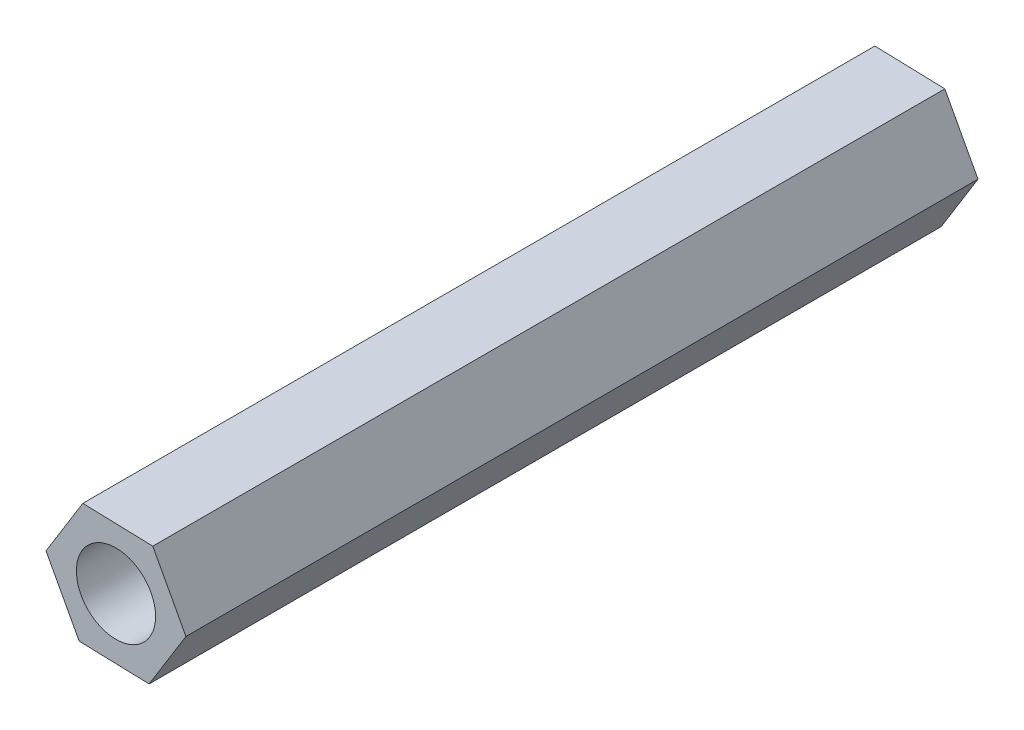
ISO-10303-21;
HEADER;
FILE_DESCRIPTION(('STEP AP214'),'2;1');
FILE_NAME('part.step','',(''),(''),'','','');
FILE_SCHEMA(('AUTOMOTIVE_DESIGN { 1 0 10303 214 1 1 1 1 }'));
ENDSEC;
DATA;
#1=APPLICATION_CONTEXT('core data for automotive mechanical design processes');
#2=APPLICATION_PROTOCOL_DEFINITION('international standard','automotive_design',2000,#1);
#3=PRODUCT_CONTEXT('',#1,'mechanical');
#4=PRODUCT('Part','Part','',(#3));
#5=PRODUCT_RELATED_PRODUCT_CATEGORY('part','',(#4));
#6=PRODUCT_DEFINITION_FORMATION('','',#4);
#7=PRODUCT_DEFINITION_CONTEXT('part definition',#1,'design');
#8=PRODUCT_DEFINITION('design','',#6,#7);
#9=PRODUCT_DEFINITION_SHAPE('','',#8);
#10=(LENGTH_UNIT() NAMED_UNIT(*) SI_UNIT(.MILLI.,.METRE.));
#11=(NAMED_UNIT(*) PLANE_ANGLE_UNIT() SI_UNIT($,.RADIAN.));
#12=(NAMED_UNIT(*) SI_UNIT($,.STERADIAN.) SOLID_ANGLE_UNIT());
#13=UNCERTAINTY_MEASURE_WITH_UNIT(LENGTH_MEASURE(1.E-05),#10,'distance_accuracy_value','');
#14=(GEOMETRIC_REPRESENTATION_CONTEXT(3) GLOBAL_UNCERTAINTY_ASSIGNED_CONTEXT((#13)) GLOBAL_UNIT_ASSIGNED_CONTEXT((#10,
#11,#12)) REPRESENTATION_CONTEXT('',''));
#15=CARTESIAN_POINT('',(0.,0.,0.));
#16=DIRECTION('',(0.,0.,1.));
#17=DIRECTION('',(1.,0.,0.));
#18=AXIS2_PLACEMENT_3D('',#15,#16,#17);
#19=CARTESIAN_POINT('',(0.,0.,30.));
#20=DIRECTION('',(0.,0.,1.));
#21=DIRECTION('',(1.,0.,0.));
#22=AXIS2_PLACEMENT_3D('',#19,#20,#21);
#23=PLANE('',#22);
#24=DIRECTION('',(0.999547968895249,-0.0300642291998806,0.));
#25=VECTOR('',#24,1.);
#26=CARTESIAN_POINT('',(-1.39402762614969,-2.25511420148972,30.));
#27=LINE('',#26,#25);
#28=CARTESIAN_POINT('',(-1.39402762614969,-2.25511420148972,30.));
#29=VERTEX_POINT('',#28);
#30=CARTESIAN_POINT('',(1.25597237385031,-2.33482043856781,30.));
#31=VERTEX_POINT('',#30);
#32=EDGE_CURVE('E131',#29,#31,#27,.T.);
#33=ORIENTED_EDGE('',*,*,#32,.T.);
#34=DIRECTION('',(0.525810370679919,0.850601818764483,0.));
#35=VECTOR('',#34,1.);
#36=CARTESIAN_POINT('',(1.25597237385031,-2.33482043856781,30.));
#37=LINE('',#36,#35);
#38=CARTESIAN_POINT('',(2.65,-0.0797062370780844,30.));
#39=VERTEX_POINT('',#38);
#40=EDGE_CURVE('E89',#31,#39,#37,.T.);
#41=ORIENTED_EDGE('',*,*,#40,.T.);
#42=DIRECTION('',(-0.47373759821533,0.880666047964363,0.));
#43=VECTOR('',#42,1.);
#44=CARTESIAN_POINT('',(2.65,-0.0797062370780844,30.));
#45=LINE('',#44,#43);
#46=CARTESIAN_POINT('',(1.39402762614969,2.25511420148972,30.));
#47=VERTEX_POINT('',#46);
#48=EDGE_CURVE('E102',#39,#47,#45,.T.);
#49=ORIENTED_EDGE('',*,*,#48,.T.);
#50=DIRECTION('',(-0.999547968895249,0.0300642291998806,0.));
#51=VECTOR('',#50,1.);
#52=CARTESIAN_POINT('',(1.39402762614969,2.25511420148972,30.));
#53=LINE('',#52,#51);
#54=CARTESIAN_POINT('',(-1.25597237385031,2.33482043856781,30.));
#55=VERTEX_POINT('',#54);
#56=EDGE_CURVE('E96',#47,#55,#53,.T.);
#57=ORIENTED_EDGE('',*,*,#56,.T.);
#58=DIRECTION('',(-0.525810370679919,-0.850601818764483,0.));
#59=VECTOR('',#58,1.);
#60=CARTESIAN_POINT('',(-1.25597237385031,2.33482043856781,30.));
#61=LINE('',#60,#59);
#62=CARTESIAN_POINT('',(-2.65,0.0797062370780848,30.));
#63=VERTEX_POINT('',#62);
#64=EDGE_CURVE('E100',#55,#63,#61,.T.);
#65=ORIENTED_EDGE('',*,*,#64,.T.);
#66=DIRECTION('',(0.47373759821533,-0.880666047964363,0.));
#67=VECTOR('',#66,1.);
#68=CARTESIAN_POINT('',(-2.65,0.0797062370780848,30.));
#69=LINE('',#68,#67);
#70=EDGE_CURVE('E52',#63,#29,#69,.T.);
#71=ORIENTED_EDGE('',*,*,#70,.T.);
#72=EDGE_LOOP('',(#33,#41,#49,#57,#65,#71));
#73=FACE_BOUND('',#72,.T.);
#74=CARTESIAN_POINT('',(0.,0.,30.));
#75=DIRECTION('',(0.,0.,1.));
#76=DIRECTION('',(1.,0.,0.));
#77=AXIS2_PLACEMENT_3D('',#74,#75,#76);
#78=CIRCLE('',#77,1.5);
#79=CARTESIAN_POINT('',(1.5,0.,30.));
#80=VERTEX_POINT('',#79);
#81=EDGE_CURVE('E124',#80,#80,#78,.T.);
#82=ORIENTED_EDGE('',*,*,#81,.F.);
#83=EDGE_LOOP('',(#82));
#84=FACE_BOUND('',#83,.T.);
#85=ADVANCED_FACE('F35',(#73,#84),#23,.T.);
#86=CARTESIAN_POINT('',(0.,0.,0.));
#87=DIRECTION('',(0.,0.,1.));
#88=DIRECTION('',(1.,0.,0.));
#89=AXIS2_PLACEMENT_3D('',#86,#87,#88);
#90=PLANE('',#89);
#91=DIRECTION('',(0.999547968895249,-0.0300642291998806,0.));
#92=VECTOR('',#91,1.);
#93=CARTESIAN_POINT('',(-1.39402762614969,-2.25511420148972,0.));
#94=LINE('',#93,#92);
#95=CARTESIAN_POINT('',(-1.39402762614969,-2.25511420148972,0.));
#96=VERTEX_POINT('',#95);
#97=CARTESIAN_POINT('',(1.25597237385031,-2.33482043856781,0.));
#98=VERTEX_POINT('',#97);
#99=EDGE_CURVE('E120',#96,#98,#94,.T.);
#100=ORIENTED_EDGE('',*,*,#99,.F.);
#101=DIRECTION('',(0.47373759821533,-0.880666047964363,0.));
#102=VECTOR('',#101,1.);
#103=CARTESIAN_POINT('',(-2.65,0.0797062370780848,0.));
#104=LINE('',#103,#102);
#105=CARTESIAN_POINT('',(-2.65,0.0797062370780848,0.));
#106=VERTEX_POINT('',#105);
#107=EDGE_CURVE('E81',#106,#96,#104,.T.);
#108=ORIENTED_EDGE('',*,*,#107,.F.);
#109=DIRECTION('',(-0.525810370679919,-0.850601818764483,0.));
#110=VECTOR('',#109,1.);
#111=CARTESIAN_POINT('',(-1.25597237385031,2.33482043856781,0.));
#112=LINE('',#111,#110);
#113=CARTESIAN_POINT('',(-1.25597237385031,2.33482043856781,0.));
#114=VERTEX_POINT('',#113);
#115=EDGE_CURVE('E75',#114,#106,#112,.T.);
#116=ORIENTED_EDGE('',*,*,#115,.F.);
#117=DIRECTION('',(-0.999547968895249,0.0300642291998806,0.));
#118=VECTOR('',#117,1.);
#119=CARTESIAN_POINT('',(1.39402762614969,2.25511420148972,0.));
#120=LINE('',#119,#118);
#121=CARTESIAN_POINT('',(1.39402762614969,2.25511420148972,0.));
#122=VERTEX_POINT('',#121);
#123=EDGE_CURVE('E110',#122,#114,#120,.T.);
#124=ORIENTED_EDGE('',*,*,#123,.F.);
#125=DIRECTION('',(-0.47373759821533,0.880666047964363,0.));
#126=VECTOR('',#125,1.);
#127=CARTESIAN_POINT('',(2.65,-0.0797062370780844,0.));
#128=LINE('',#127,#126);
#129=CARTESIAN_POINT('',(2.65,-0.0797062370780844,0.));
#130=VERTEX_POINT('',#129);
#131=EDGE_CURVE('E126',#130,#122,#128,.T.);
#132=ORIENTED_EDGE('',*,*,#131,.F.);
#133=DIRECTION('',(0.525810370679919,0.850601818764483,0.));
#134=VECTOR('',#133,1.);
#135=CARTESIAN_POINT('',(1.25597237385031,-2.33482043856781,0.));
#136=LINE('',#135,#134);
#137=EDGE_CURVE('E123',#98,#130,#136,.T.);
#138=ORIENTED_EDGE('',*,*,#137,.F.);
#139=EDGE_LOOP('',(#100,#108,#116,#124,#132,#138));
#140=FACE_BOUND('',#139,.T.);
#141=CARTESIAN_POINT('',(0.,0.,0.));
#142=DIRECTION('',(0.,0.,1.));
#143=DIRECTION('',(1.,0.,0.));
#144=AXIS2_PLACEMENT_3D('',#141,#142,#143);
#145=CIRCLE('',#144,1.5);
#146=CARTESIAN_POINT('',(1.5,0.,0.));
#147=VERTEX_POINT('',#146);
#148=EDGE_CURVE('E224',#147,#147,#145,.T.);
#149=ORIENTED_EDGE('',*,*,#148,.T.);
#150=EDGE_LOOP('',(#149));
#151=FACE_BOUND('',#150,.T.);
#152=ADVANCED_FACE('F140',(#140,#151),#90,.F.);
#153=CARTESIAN_POINT('',(-1.39402762614969,-2.25511420148972,30.));
#154=DIRECTION('',(0.0300642291998806,0.999547968895249,0.));
#155=DIRECTION('',(-0.999547968895249,0.0300642291998806,0.));
#156=AXIS2_PLACEMENT_3D('',#153,#154,#155);
#157=PLANE('',#156);
#158=ORIENTED_EDGE('',*,*,#99,.T.);
#159=DIRECTION('',(0.,0.,-1.));
#160=VECTOR('',#159,1.);
#161=CARTESIAN_POINT('',(1.25597237385031,-2.33482043856781,30.));
#162=LINE('',#161,#160);
#163=EDGE_CURVE('E11',#31,#98,#162,.T.);
#164=ORIENTED_EDGE('',*,*,#163,.F.);
#165=ORIENTED_EDGE('',*,*,#32,.F.);
#166=DIRECTION('',(0.,0.,-1.));
#167=VECTOR('',#166,1.);
#168=CARTESIAN_POINT('',(-1.39402762614969,-2.25511420148972,30.));
#169=LINE('',#168,#167);
#170=EDGE_CURVE('E116',#29,#96,#169,.T.);
#171=ORIENTED_EDGE('',*,*,#170,.T.);
#172=EDGE_LOOP('',(#158,#164,#165,#171));
#173=FACE_BOUND('',#172,.T.);
#174=ADVANCED_FACE('F37',(#173),#157,.F.);
#175=CARTESIAN_POINT('',(1.25597237385031,-2.33482043856781,30.));
#176=DIRECTION('',(-0.850601818764483,0.525810370679919,0.));
#177=DIRECTION('',(-0.525810370679919,-0.850601818764483,0.));
#178=AXIS2_PLACEMENT_3D('',#175,#176,#177);
#179=PLANE('',#178);
#180=ORIENTED_EDGE('',*,*,#137,.T.);
#181=DIRECTION('',(0.,0.,-1.));
#182=VECTOR('',#181,1.);
#183=CARTESIAN_POINT('',(2.65,-0.0797062370780844,30.));
#184=LINE('',#183,#182);
#185=EDGE_CURVE('E44',#39,#130,#184,.T.);
#186=ORIENTED_EDGE('',*,*,#185,.F.);
#187=ORIENTED_EDGE('',*,*,#40,.F.);
#188=ORIENTED_EDGE('',*,*,#163,.T.);
#189=EDGE_LOOP('',(#180,#186,#187,#188));
#190=FACE_BOUND('',#189,.T.);
#191=ADVANCED_FACE('F165',(#190),#179,.F.);
#192=CARTESIAN_POINT('',(2.65,-0.0797062370780844,30.));
#193=DIRECTION('',(-0.880666047964363,-0.47373759821533,0.));
#194=DIRECTION('',(0.47373759821533,-0.880666047964363,0.));
#195=AXIS2_PLACEMENT_3D('',#192,#193,#194);
#196=PLANE('',#195);
#197=ORIENTED_EDGE('',*,*,#131,.T.);
#198=DIRECTION('',(0.,0.,-1.));
#199=VECTOR('',#198,1.);
#200=CARTESIAN_POINT('',(1.39402762614969,2.25511420148972,30.));
#201=LINE('',#200,#199);
#202=EDGE_CURVE('E111',#47,#122,#201,.T.);
#203=ORIENTED_EDGE('',*,*,#202,.F.);
#204=ORIENTED_EDGE('',*,*,#48,.F.);
#205=ORIENTED_EDGE('',*,*,#185,.T.);
#206=EDGE_LOOP('',(#197,#203,#204,#205));
#207=FACE_BOUND('',#206,.T.);
#208=ADVANCED_FACE('F137',(#207),#196,.F.);
#209=CARTESIAN_POINT('',(1.39402762614969,2.25511420148972,30.));
#210=DIRECTION('',(-0.0300642291998806,-0.999547968895249,0.));
#211=DIRECTION('',(0.999547968895249,-0.0300642291998806,0.));
#212=AXIS2_PLACEMENT_3D('',#209,#210,#211);
#213=PLANE('',#212);
#214=ORIENTED_EDGE('',*,*,#123,.T.);
#215=DIRECTION('',(0.,0.,-1.));
#216=VECTOR('',#215,1.);
#217=CARTESIAN_POINT('',(-1.25597237385031,2.33482043856781,30.));
#218=LINE('',#217,#216);
#219=EDGE_CURVE('E107',#55,#114,#218,.T.);
#220=ORIENTED_EDGE('',*,*,#219,.F.);
#221=ORIENTED_EDGE('',*,*,#56,.F.);
#222=ORIENTED_EDGE('',*,*,#202,.T.);
#223=EDGE_LOOP('',(#214,#220,#221,#222));
#224=FACE_BOUND('',#223,.T.);
#225=ADVANCED_FACE('F108',(#224),#213,.F.);
#226=CARTESIAN_POINT('',(-1.25597237385031,2.33482043856781,30.));
#227=DIRECTION('',(0.850601818764483,-0.525810370679918,0.));
#228=DIRECTION('',(0.525810370679919,0.850601818764483,0.));
#229=AXIS2_PLACEMENT_3D('',#226,#227,#228);
#230=PLANE('',#229);
#231=ORIENTED_EDGE('',*,*,#115,.T.);
#232=DIRECTION('',(0.,0.,-1.));
#233=VECTOR('',#232,1.);
#234=CARTESIAN_POINT('',(-2.65,0.0797062370780848,30.));
#235=LINE('',#234,#233);
#236=EDGE_CURVE('E112',#63,#106,#235,.T.);
#237=ORIENTED_EDGE('',*,*,#236,.F.);
#238=ORIENTED_EDGE('',*,*,#64,.F.);
#239=ORIENTED_EDGE('',*,*,#219,.T.);
#240=EDGE_LOOP('',(#231,#237,#238,#239));
#241=FACE_BOUND('',#240,.T.);
#242=ADVANCED_FACE('F114',(#241),#230,.F.);
#243=CARTESIAN_POINT('',(-2.65,0.0797062370780848,30.));
#244=DIRECTION('',(0.880666047964363,0.47373759821533,0.));
#245=DIRECTION('',(-0.47373759821533,0.880666047964364,0.));
#246=AXIS2_PLACEMENT_3D('',#243,#244,#245);
#247=PLANE('',#246);
#248=ORIENTED_EDGE('',*,*,#107,.T.);
#249=ORIENTED_EDGE('',*,*,#170,.F.);
#250=ORIENTED_EDGE('',*,*,#70,.F.);
#251=ORIENTED_EDGE('',*,*,#236,.T.);
#252=EDGE_LOOP('',(#248,#249,#250,#251));
#253=FACE_BOUND('',#252,.T.);
#254=ADVANCED_FACE('F145',(#253),#247,.F.);
#255=CARTESIAN_POINT('',(0.,0.,30.));
#256=DIRECTION('',(0.,0.,-1.));
#257=DIRECTION('',(-1.,0.,0.));
#258=AXIS2_PLACEMENT_3D('',#255,#256,#257);
#259=CYLINDRICAL_SURFACE('',#258,1.5);
#260=ORIENTED_EDGE('',*,*,#81,.T.);
#261=EDGE_LOOP('',(#260));
#262=FACE_BOUND('',#261,.T.);
#263=ORIENTED_EDGE('',*,*,#148,.F.);
#264=EDGE_LOOP('',(#263));
#265=FACE_BOUND('',#264,.T.);
#266=ADVANCED_FACE('F147',(#262,#265),#259,.F.);
#267=CLOSED_SHELL('',(#85,#152,#174,#191,#208,#225,#242,#254,#266));
#268=MANIFOLD_SOLID_BREP('B2',#267);
#269=ADVANCED_BREP_SHAPE_REPRESENTATION('',(#18,#268),#14);
#270=SHAPE_DEFINITION_REPRESENTATION(#9,#269);
ENDSEC;
END-ISO-10303-21;
